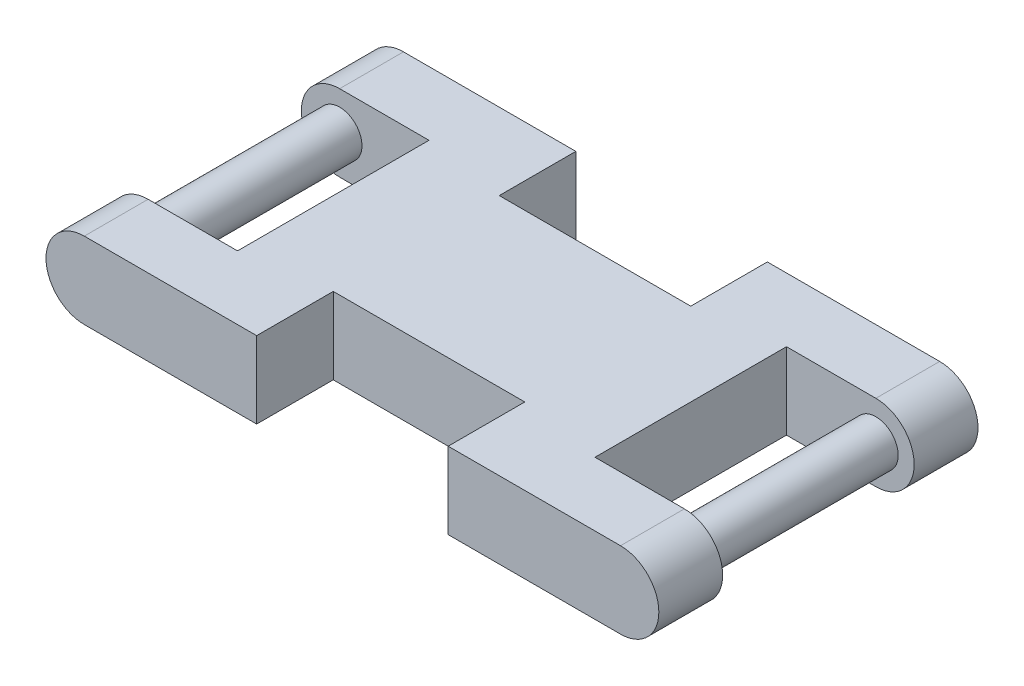
ISO-10303-21;
HEADER;
FILE_DESCRIPTION(('STEP AP214'),'2;1');
FILE_NAME('part.step','',(''),(''),'','','');
FILE_SCHEMA(('AUTOMOTIVE_DESIGN { 1 0 10303 214 1 1 1 1 }'));
ENDSEC;
DATA;
#1=APPLICATION_CONTEXT('core data for automotive mechanical design processes');
#2=APPLICATION_PROTOCOL_DEFINITION('international standard','automotive_design',2000,#1);
#3=PRODUCT_CONTEXT('',#1,'mechanical');
#4=PRODUCT('Part','Part','',(#3));
#5=PRODUCT_RELATED_PRODUCT_CATEGORY('part','',(#4));
#6=PRODUCT_DEFINITION_FORMATION('','',#4);
#7=PRODUCT_DEFINITION_CONTEXT('part definition',#1,'design');
#8=PRODUCT_DEFINITION('design','',#6,#7);
#9=PRODUCT_DEFINITION_SHAPE('','',#8);
#10=(LENGTH_UNIT() NAMED_UNIT(*) SI_UNIT(.MILLI.,.METRE.));
#11=(NAMED_UNIT(*) PLANE_ANGLE_UNIT() SI_UNIT($,.RADIAN.));
#12=(NAMED_UNIT(*) SI_UNIT($,.STERADIAN.) SOLID_ANGLE_UNIT());
#13=UNCERTAINTY_MEASURE_WITH_UNIT(LENGTH_MEASURE(1.E-05),#10,'distance_accuracy_value','');
#14=(GEOMETRIC_REPRESENTATION_CONTEXT(3) GLOBAL_UNCERTAINTY_ASSIGNED_CONTEXT((#13)) GLOBAL_UNIT_ASSIGNED_CONTEXT((#10,
#11,#12)) REPRESENTATION_CONTEXT('',''));
#15=CARTESIAN_POINT('',(0.,0.,0.));
#16=DIRECTION('',(0.,0.,1.));
#17=DIRECTION('',(1.,0.,0.));
#18=AXIS2_PLACEMENT_3D('',#15,#16,#17);
#19=CARTESIAN_POINT('',(-105.,-15.,125.));
#20=DIRECTION('',(0.,1.,0.));
#21=DIRECTION('',(-1.,0.,0.));
#22=AXIS2_PLACEMENT_3D('',#19,#20,#21);
#23=PLANE('',#22);
#24=DIRECTION('',(0.,0.,1.));
#25=VECTOR('',#24,1.);
#26=CARTESIAN_POINT('',(37.5,-15.0000000000001,0.));
#27=LINE('',#26,#25);
#28=CARTESIAN_POINT('',(37.5,-15.0000000000001,0.));
#29=VERTEX_POINT('',#28);
#30=CARTESIAN_POINT('',(37.5,-15.0000000000001,30.));
#31=VERTEX_POINT('',#30);
#32=EDGE_CURVE('E201',#29,#31,#27,.T.);
#33=ORIENTED_EDGE('',*,*,#32,.F.);
#34=DIRECTION('',(1.,0.,0.));
#35=VECTOR('',#34,1.);
#36=CARTESIAN_POINT('',(-105.,-15.,0.));
#37=LINE('',#36,#35);
#38=CARTESIAN_POINT('',(105.,-15.,0.));
#39=VERTEX_POINT('',#38);
#40=EDGE_CURVE('E364',#29,#39,#37,.T.);
#41=ORIENTED_EDGE('',*,*,#40,.T.);
#42=DIRECTION('',(0.,0.,-1.));
#43=VECTOR('',#42,1.);
#44=CARTESIAN_POINT('',(105.,-15.,125.));
#45=LINE('',#44,#43);
#46=CARTESIAN_POINT('',(105.,-15.,25.));
#47=VERTEX_POINT('',#46);
#48=EDGE_CURVE('E384',#47,#39,#45,.T.);
#49=ORIENTED_EDGE('',*,*,#48,.F.);
#50=DIRECTION('',(1.,0.,0.));
#51=VECTOR('',#50,1.);
#52=CARTESIAN_POINT('',(-105.,-15.,25.0000000000001));
#53=LINE('',#52,#51);
#54=CARTESIAN_POINT('',(70.0000000000001,-15.,25.));
#55=VERTEX_POINT('',#54);
#56=EDGE_CURVE('E321',#55,#47,#53,.T.);
#57=ORIENTED_EDGE('',*,*,#56,.F.);
#58=DIRECTION('',(0.,0.,1.));
#59=VECTOR('',#58,1.);
#60=CARTESIAN_POINT('',(70.0000000000001,-15.,125.));
#61=LINE('',#60,#59);
#62=CARTESIAN_POINT('',(70.0000000000001,-15.,100.));
#63=VERTEX_POINT('',#62);
#64=EDGE_CURVE('E287',#55,#63,#61,.T.);
#65=ORIENTED_EDGE('',*,*,#64,.T.);
#66=DIRECTION('',(1.,0.,0.));
#67=VECTOR('',#66,1.);
#68=CARTESIAN_POINT('',(-105.,-15.,99.9999999999999));
#69=LINE('',#68,#67);
#70=CARTESIAN_POINT('',(105.,-15.,100.));
#71=VERTEX_POINT('',#70);
#72=EDGE_CURVE('E314',#63,#71,#69,.T.);
#73=ORIENTED_EDGE('',*,*,#72,.T.);
#74=CARTESIAN_POINT('',(105.,-15.,125.));
#75=VERTEX_POINT('',#74);
#76=EDGE_CURVE('E385',#75,#71,#45,.T.);
#77=ORIENTED_EDGE('',*,*,#76,.F.);
#78=DIRECTION('',(1.,0.,0.));
#79=VECTOR('',#78,1.);
#80=CARTESIAN_POINT('',(-105.,-15.,125.));
#81=LINE('',#80,#79);
#82=CARTESIAN_POINT('',(37.5,-15.,125.));
#83=VERTEX_POINT('',#82);
#84=EDGE_CURVE('E346',#83,#75,#81,.T.);
#85=ORIENTED_EDGE('',*,*,#84,.F.);
#86=DIRECTION('',(0.,0.,-1.));
#87=VECTOR('',#86,1.);
#88=CARTESIAN_POINT('',(37.5,-15.0000000000001,0.));
#89=LINE('',#88,#87);
#90=CARTESIAN_POINT('',(37.5,-15.0000000000001,95.));
#91=VERTEX_POINT('',#90);
#92=EDGE_CURVE('E61',#83,#91,#89,.T.);
#93=ORIENTED_EDGE('',*,*,#92,.T.);
#94=DIRECTION('',(1.,0.,0.));
#95=VECTOR('',#94,1.);
#96=CARTESIAN_POINT('',(0.,-15.0000000000001,95.));
#97=LINE('',#96,#95);
#98=CARTESIAN_POINT('',(-37.5,-15.0000000000001,95.));
#99=VERTEX_POINT('',#98);
#100=EDGE_CURVE('E232',#99,#91,#97,.T.);
#101=ORIENTED_EDGE('',*,*,#100,.F.);
#102=DIRECTION('',(0.,0.,-1.));
#103=VECTOR('',#102,1.);
#104=CARTESIAN_POINT('',(-37.5,-15.0000000000001,0.));
#105=LINE('',#104,#103);
#106=CARTESIAN_POINT('',(-37.5,-15.0000000000001,125.));
#107=VERTEX_POINT('',#106);
#108=EDGE_CURVE('E236',#107,#99,#105,.T.);
#109=ORIENTED_EDGE('',*,*,#108,.F.);
#110=CARTESIAN_POINT('',(-105.,-15.,125.));
#111=VERTEX_POINT('',#110);
#112=EDGE_CURVE('E348',#111,#107,#81,.T.);
#113=ORIENTED_EDGE('',*,*,#112,.F.);
#114=DIRECTION('',(0.,0.,-1.));
#115=VECTOR('',#114,1.);
#116=CARTESIAN_POINT('',(-105.,-15.,125.));
#117=LINE('',#116,#115);
#118=CARTESIAN_POINT('',(-105.,-15.,100.));
#119=VERTEX_POINT('',#118);
#120=EDGE_CURVE('E390',#111,#119,#117,.T.);
#121=ORIENTED_EDGE('',*,*,#120,.T.);
#122=DIRECTION('',(-1.,0.,0.));
#123=VECTOR('',#122,1.);
#124=CARTESIAN_POINT('',(-105.,-15.,100.));
#125=LINE('',#124,#123);
#126=CARTESIAN_POINT('',(-70.,-15.,100.));
#127=VERTEX_POINT('',#126);
#128=EDGE_CURVE('E334',#127,#119,#125,.T.);
#129=ORIENTED_EDGE('',*,*,#128,.F.);
#130=DIRECTION('',(0.,0.,1.));
#131=VECTOR('',#130,1.);
#132=CARTESIAN_POINT('',(-70.,-15.,125.));
#133=LINE('',#132,#131);
#134=CARTESIAN_POINT('',(-70.,-15.,25.));
#135=VERTEX_POINT('',#134);
#136=EDGE_CURVE('E324',#135,#127,#133,.T.);
#137=ORIENTED_EDGE('',*,*,#136,.F.);
#138=DIRECTION('',(-1.,0.,0.));
#139=VECTOR('',#138,1.);
#140=CARTESIAN_POINT('',(-105.,-15.,25.));
#141=LINE('',#140,#139);
#142=CARTESIAN_POINT('',(-105.,-15.,25.));
#143=VERTEX_POINT('',#142);
#144=EDGE_CURVE('E327',#135,#143,#141,.T.);
#145=ORIENTED_EDGE('',*,*,#144,.T.);
#146=CARTESIAN_POINT('',(-105.,-15.,0.));
#147=VERTEX_POINT('',#146);
#148=EDGE_CURVE('E389',#143,#147,#117,.T.);
#149=ORIENTED_EDGE('',*,*,#148,.T.);
#150=CARTESIAN_POINT('',(-37.5,-15.,0.));
#151=VERTEX_POINT('',#150);
#152=EDGE_CURVE('E205',#147,#151,#37,.T.);
#153=ORIENTED_EDGE('',*,*,#152,.T.);
#154=DIRECTION('',(0.,0.,1.));
#155=VECTOR('',#154,1.);
#156=CARTESIAN_POINT('',(-37.5,-15.0000000000001,0.));
#157=LINE('',#156,#155);
#158=CARTESIAN_POINT('',(-37.5,-15.0000000000001,30.));
#159=VERTEX_POINT('',#158);
#160=EDGE_CURVE('E69',#151,#159,#157,.T.);
#161=ORIENTED_EDGE('',*,*,#160,.T.);
#162=DIRECTION('',(1.,0.,0.));
#163=VECTOR('',#162,1.);
#164=CARTESIAN_POINT('',(0.,-15.0000000000001,30.));
#165=LINE('',#164,#163);
#166=EDGE_CURVE('E196',#159,#31,#165,.T.);
#167=ORIENTED_EDGE('',*,*,#166,.T.);
#168=EDGE_LOOP('',(#33,#41,#49,#57,#65,#73,#77,#85,#93,#101,#109,#113,#121,#129,#137,#145,#149,
#153,#161,#167));
#169=FACE_BOUND('',#168,.T.);
#170=ADVANCED_FACE('F45',(#169),#23,.F.);
#171=CARTESIAN_POINT('',(-105.,15.,125.));
#172=DIRECTION('',(0.,-1.,0.));
#173=DIRECTION('',(1.,0.,0.));
#174=AXIS2_PLACEMENT_3D('',#171,#172,#173);
#175=PLANE('',#174);
#176=DIRECTION('',(0.,0.,1.));
#177=VECTOR('',#176,1.);
#178=CARTESIAN_POINT('',(37.5,15.0000000000001,0.));
#179=LINE('',#178,#177);
#180=CARTESIAN_POINT('',(37.5,15.0000000000001,0.));
#181=VERTEX_POINT('',#180);
#182=CARTESIAN_POINT('',(37.5,15.0000000000001,30.));
#183=VERTEX_POINT('',#182);
#184=EDGE_CURVE('E207',#181,#183,#179,.T.);
#185=ORIENTED_EDGE('',*,*,#184,.T.);
#186=DIRECTION('',(1.,0.,0.));
#187=VECTOR('',#186,1.);
#188=CARTESIAN_POINT('',(0.,15.0000000000001,30.));
#189=LINE('',#188,#187);
#190=CARTESIAN_POINT('',(-37.5,15.,30.));
#191=VERTEX_POINT('',#190);
#192=EDGE_CURVE('E211',#191,#183,#189,.T.);
#193=ORIENTED_EDGE('',*,*,#192,.F.);
#194=DIRECTION('',(0.,0.,1.));
#195=VECTOR('',#194,1.);
#196=CARTESIAN_POINT('',(-37.5,15.,0.));
#197=LINE('',#196,#195);
#198=CARTESIAN_POINT('',(-37.5,15.,0.));
#199=VERTEX_POINT('',#198);
#200=EDGE_CURVE('E186',#199,#191,#197,.T.);
#201=ORIENTED_EDGE('',*,*,#200,.F.);
#202=DIRECTION('',(-1.,0.,0.));
#203=VECTOR('',#202,1.);
#204=CARTESIAN_POINT('',(-105.,15.,0.));
#205=LINE('',#204,#203);
#206=CARTESIAN_POINT('',(-105.,15.,0.));
#207=VERTEX_POINT('',#206);
#208=EDGE_CURVE('E371',#199,#207,#205,.T.);
#209=ORIENTED_EDGE('',*,*,#208,.T.);
#210=DIRECTION('',(0.,0.,-1.));
#211=VECTOR('',#210,1.);
#212=CARTESIAN_POINT('',(-105.,15.,125.));
#213=LINE('',#212,#211);
#214=CARTESIAN_POINT('',(-105.,15.,25.));
#215=VERTEX_POINT('',#214);
#216=EDGE_CURVE('E360',#215,#207,#213,.T.);
#217=ORIENTED_EDGE('',*,*,#216,.F.);
#218=DIRECTION('',(-1.,0.,0.));
#219=VECTOR('',#218,1.);
#220=CARTESIAN_POINT('',(0.,15.0000000000001,25.));
#221=LINE('',#220,#219);
#222=CARTESIAN_POINT('',(-70.,15.,25.));
#223=VERTEX_POINT('',#222);
#224=EDGE_CURVE('E279',#223,#215,#221,.T.);
#225=ORIENTED_EDGE('',*,*,#224,.F.);
#226=DIRECTION('',(0.,0.,1.));
#227=VECTOR('',#226,1.);
#228=CARTESIAN_POINT('',(-70.,15.,0.));
#229=LINE('',#228,#227);
#230=CARTESIAN_POINT('',(-70.,15.,100.));
#231=VERTEX_POINT('',#230);
#232=EDGE_CURVE('E274',#223,#231,#229,.T.);
#233=ORIENTED_EDGE('',*,*,#232,.T.);
#234=DIRECTION('',(-1.,0.,0.));
#235=VECTOR('',#234,1.);
#236=CARTESIAN_POINT('',(0.,15.0000000000001,100.));
#237=LINE('',#236,#235);
#238=CARTESIAN_POINT('',(-105.,15.,100.));
#239=VERTEX_POINT('',#238);
#240=EDGE_CURVE('E270',#231,#239,#237,.T.);
#241=ORIENTED_EDGE('',*,*,#240,.T.);
#242=CARTESIAN_POINT('',(-105.,15.,125.));
#243=VERTEX_POINT('',#242);
#244=EDGE_CURVE('E375',#243,#239,#213,.T.);
#245=ORIENTED_EDGE('',*,*,#244,.F.);
#246=DIRECTION('',(-1.,0.,0.));
#247=VECTOR('',#246,1.);
#248=CARTESIAN_POINT('',(-105.,15.,125.));
#249=LINE('',#248,#247);
#250=CARTESIAN_POINT('',(-37.5,15.,125.));
#251=VERTEX_POINT('',#250);
#252=EDGE_CURVE('E355',#251,#243,#249,.T.);
#253=ORIENTED_EDGE('',*,*,#252,.F.);
#254=DIRECTION('',(0.,0.,-1.));
#255=VECTOR('',#254,1.);
#256=CARTESIAN_POINT('',(-37.5,15.,0.));
#257=LINE('',#256,#255);
#258=CARTESIAN_POINT('',(-37.5,15.,95.));
#259=VERTEX_POINT('',#258);
#260=EDGE_CURVE('E233',#251,#259,#257,.T.);
#261=ORIENTED_EDGE('',*,*,#260,.T.);
#262=DIRECTION('',(1.,0.,0.));
#263=VECTOR('',#262,1.);
#264=CARTESIAN_POINT('',(0.,15.0000000000001,95.));
#265=LINE('',#264,#263);
#266=CARTESIAN_POINT('',(37.5,15.0000000000001,95.));
#267=VERTEX_POINT('',#266);
#268=EDGE_CURVE('E244',#259,#267,#265,.T.);
#269=ORIENTED_EDGE('',*,*,#268,.T.);
#270=DIRECTION('',(0.,0.,-1.));
#271=VECTOR('',#270,1.);
#272=CARTESIAN_POINT('',(37.5,15.0000000000001,0.));
#273=LINE('',#272,#271);
#274=CARTESIAN_POINT('',(37.5,15.0000000000001,125.));
#275=VERTEX_POINT('',#274);
#276=EDGE_CURVE('E240',#275,#267,#273,.T.);
#277=ORIENTED_EDGE('',*,*,#276,.F.);
#278=CARTESIAN_POINT('',(105.,15.0000000000001,125.));
#279=VERTEX_POINT('',#278);
#280=EDGE_CURVE('E356',#279,#275,#249,.T.);
#281=ORIENTED_EDGE('',*,*,#280,.F.);
#282=DIRECTION('',(0.,0.,-1.));
#283=VECTOR('',#282,1.);
#284=CARTESIAN_POINT('',(105.,15.0000000000001,125.));
#285=LINE('',#284,#283);
#286=CARTESIAN_POINT('',(105.,15.0000000000001,100.));
#287=VERTEX_POINT('',#286);
#288=EDGE_CURVE('E380',#279,#287,#285,.T.);
#289=ORIENTED_EDGE('',*,*,#288,.T.);
#290=DIRECTION('',(1.,0.,0.));
#291=VECTOR('',#290,1.);
#292=CARTESIAN_POINT('',(0.,15.0000000000001,99.9999999999999));
#293=LINE('',#292,#291);
#294=CARTESIAN_POINT('',(70.0000000000001,15.0000000000001,100.));
#295=VERTEX_POINT('',#294);
#296=EDGE_CURVE('E298',#295,#287,#293,.T.);
#297=ORIENTED_EDGE('',*,*,#296,.F.);
#298=DIRECTION('',(0.,0.,1.));
#299=VECTOR('',#298,1.);
#300=CARTESIAN_POINT('',(70.0000000000001,15.0000000000001,0.));
#301=LINE('',#300,#299);
#302=CARTESIAN_POINT('',(70.0000000000001,15.0000000000001,25.));
#303=VERTEX_POINT('',#302);
#304=EDGE_CURVE('E294',#303,#295,#301,.T.);
#305=ORIENTED_EDGE('',*,*,#304,.F.);
#306=DIRECTION('',(1.,0.,0.));
#307=VECTOR('',#306,1.);
#308=CARTESIAN_POINT('',(0.,15.0000000000001,25.));
#309=LINE('',#308,#307);
#310=CARTESIAN_POINT('',(105.,15.0000000000001,25.));
#311=VERTEX_POINT('',#310);
#312=EDGE_CURVE('E269',#303,#311,#309,.T.);
#313=ORIENTED_EDGE('',*,*,#312,.T.);
#314=CARTESIAN_POINT('',(105.,15.0000000000001,0.));
#315=VERTEX_POINT('',#314);
#316=EDGE_CURVE('E379',#311,#315,#285,.T.);
#317=ORIENTED_EDGE('',*,*,#316,.T.);
#318=EDGE_CURVE('E347',#315,#181,#205,.T.);
#319=ORIENTED_EDGE('',*,*,#318,.T.);
#320=EDGE_LOOP('',(#185,#193,#201,#209,#217,#225,#233,#241,#245,#253,#261,#269,#277,#281,#289,
#297,#305,#313,#317,#319));
#321=FACE_BOUND('',#320,.T.);
#322=ADVANCED_FACE('F435',(#321),#175,.F.);
#323=CARTESIAN_POINT('',(-105.,0.,125.));
#324=DIRECTION('',(0.,0.,1.));
#325=DIRECTION('',(1.,0.,0.));
#326=AXIS2_PLACEMENT_3D('',#323,#324,#325);
#327=PLANE('',#326);
#328=ORIENTED_EDGE('',*,*,#112,.T.);
#329=DIRECTION('',(0.,1.,0.));
#330=VECTOR('',#329,1.);
#331=CARTESIAN_POINT('',(-37.5,-15.0000000000001,125.));
#332=LINE('',#331,#330);
#333=EDGE_CURVE('E218',#107,#251,#332,.T.);
#334=ORIENTED_EDGE('',*,*,#333,.T.);
#335=ORIENTED_EDGE('',*,*,#252,.T.);
#336=CARTESIAN_POINT('',(-105.,0.,125.));
#337=DIRECTION('',(0.,0.,1.));
#338=DIRECTION('',(1.,0.,0.));
#339=AXIS2_PLACEMENT_3D('',#336,#337,#338);
#340=CIRCLE('',#339,15.);
#341=EDGE_CURVE('E342',#243,#111,#340,.T.);
#342=ORIENTED_EDGE('',*,*,#341,.T.);
#343=EDGE_LOOP('',(#328,#334,#335,#342));
#344=FACE_BOUND('',#343,.T.);
#345=ADVANCED_FACE('F467',(#344),#327,.T.);
#346=CARTESIAN_POINT('',(-105.,0.,0.));
#347=DIRECTION('',(0.,0.,1.));
#348=DIRECTION('',(1.,0.,0.));
#349=AXIS2_PLACEMENT_3D('',#346,#347,#348);
#350=PLANE('',#349);
#351=DIRECTION('',(0.,1.,0.));
#352=VECTOR('',#351,1.);
#353=CARTESIAN_POINT('',(37.5,-15.0000000000001,0.));
#354=LINE('',#353,#352);
#355=EDGE_CURVE('E221',#29,#181,#354,.T.);
#356=ORIENTED_EDGE('',*,*,#355,.T.);
#357=ORIENTED_EDGE('',*,*,#318,.F.);
#358=CARTESIAN_POINT('',(105.,0.,0.));
#359=DIRECTION('',(0.,0.,1.));
#360=DIRECTION('',(1.,0.,0.));
#361=AXIS2_PLACEMENT_3D('',#358,#359,#360);
#362=CIRCLE('',#361,15.);
#363=EDGE_CURVE('E367',#39,#315,#362,.T.);
#364=ORIENTED_EDGE('',*,*,#363,.F.);
#365=ORIENTED_EDGE('',*,*,#40,.F.);
#366=EDGE_LOOP('',(#356,#357,#364,#365));
#367=FACE_BOUND('',#366,.T.);
#368=ADVANCED_FACE('F433',(#367),#350,.F.);
#369=CARTESIAN_POINT('',(-105.,0.,125.));
#370=DIRECTION('',(0.,0.,-1.));
#371=DIRECTION('',(-1.,0.,0.));
#372=AXIS2_PLACEMENT_3D('',#369,#370,#371);
#373=CYLINDRICAL_SURFACE('',#372,15.);
#374=CARTESIAN_POINT('',(-105.,0.,100.));
#375=DIRECTION('',(0.,0.,-1.));
#376=DIRECTION('',(-1.,0.,0.));
#377=AXIS2_PLACEMENT_3D('',#374,#375,#376);
#378=CIRCLE('',#377,15.);
#379=EDGE_CURVE('E338',#119,#239,#378,.T.);
#380=ORIENTED_EDGE('',*,*,#379,.F.);
#381=ORIENTED_EDGE('',*,*,#120,.F.);
#382=ORIENTED_EDGE('',*,*,#341,.F.);
#383=ORIENTED_EDGE('',*,*,#244,.T.);
#384=EDGE_LOOP('',(#380,#381,#382,#383));
#385=FACE_BOUND('',#384,.T.);
#386=ADVANCED_FACE('F471',(#385),#373,.T.);
#387=CARTESIAN_POINT('',(105.,0.,125.));
#388=DIRECTION('',(0.,0.,-1.));
#389=DIRECTION('',(-1.,0.,0.));
#390=AXIS2_PLACEMENT_3D('',#387,#388,#389);
#391=CYLINDRICAL_SURFACE('',#390,15.);
#392=ORIENTED_EDGE('',*,*,#316,.F.);
#393=CARTESIAN_POINT('',(105.,0.,25.));
#394=DIRECTION('',(0.,0.,1.));
#395=DIRECTION('',(1.,0.,0.));
#396=AXIS2_PLACEMENT_3D('',#393,#394,#395);
#397=CIRCLE('',#396,15.);
#398=EDGE_CURVE('E318',#47,#311,#397,.T.);
#399=ORIENTED_EDGE('',*,*,#398,.F.);
#400=ORIENTED_EDGE('',*,*,#48,.T.);
#401=ORIENTED_EDGE('',*,*,#363,.T.);
#402=EDGE_LOOP('',(#392,#399,#400,#401));
#403=FACE_BOUND('',#402,.T.);
#404=ADVANCED_FACE('F431',(#403),#391,.T.);
#405=CARTESIAN_POINT('',(-105.,0.,25.));
#406=DIRECTION('',(0.,0.,-1.));
#407=DIRECTION('',(-1.,0.,0.));
#408=AXIS2_PLACEMENT_3D('',#405,#406,#407);
#409=CIRCLE('',#408,15.);
#410=EDGE_CURVE('E331',#143,#215,#409,.T.);
#411=ORIENTED_EDGE('',*,*,#410,.T.);
#412=ORIENTED_EDGE('',*,*,#216,.T.);
#413=CARTESIAN_POINT('',(-105.,0.,0.));
#414=DIRECTION('',(0.,0.,1.));
#415=DIRECTION('',(1.,0.,0.));
#416=AXIS2_PLACEMENT_3D('',#413,#414,#415);
#417=CIRCLE('',#416,15.);
#418=EDGE_CURVE('E341',#207,#147,#417,.T.);
#419=ORIENTED_EDGE('',*,*,#418,.T.);
#420=ORIENTED_EDGE('',*,*,#148,.F.);
#421=EDGE_LOOP('',(#411,#412,#419,#420));
#422=FACE_BOUND('',#421,.T.);
#423=ADVANCED_FACE('F47',(#422),#373,.T.);
#424=CARTESIAN_POINT('',(105.,0.,100.));
#425=DIRECTION('',(0.,0.,1.));
#426=DIRECTION('',(1.,0.,0.));
#427=AXIS2_PLACEMENT_3D('',#424,#425,#426);
#428=CIRCLE('',#427,15.);
#429=EDGE_CURVE('E311',#71,#287,#428,.T.);
#430=ORIENTED_EDGE('',*,*,#429,.T.);
#431=ORIENTED_EDGE('',*,*,#288,.F.);
#432=CARTESIAN_POINT('',(105.,0.,125.));
#433=DIRECTION('',(0.,0.,1.));
#434=DIRECTION('',(1.,0.,0.));
#435=AXIS2_PLACEMENT_3D('',#432,#433,#434);
#436=CIRCLE('',#435,15.);
#437=EDGE_CURVE('E352',#75,#279,#436,.T.);
#438=ORIENTED_EDGE('',*,*,#437,.F.);
#439=ORIENTED_EDGE('',*,*,#76,.T.);
#440=EDGE_LOOP('',(#430,#431,#438,#439));
#441=FACE_BOUND('',#440,.T.);
#442=ADVANCED_FACE('F449',(#441),#391,.T.);
#443=DIRECTION('',(0.,1.,0.));
#444=VECTOR('',#443,1.);
#445=CARTESIAN_POINT('',(37.5,-15.0000000000001,125.));
#446=LINE('',#445,#444);
#447=EDGE_CURVE('E239',#83,#275,#446,.T.);
#448=ORIENTED_EDGE('',*,*,#447,.F.);
#449=ORIENTED_EDGE('',*,*,#84,.T.);
#450=ORIENTED_EDGE('',*,*,#437,.T.);
#451=ORIENTED_EDGE('',*,*,#280,.T.);
#452=EDGE_LOOP('',(#448,#449,#450,#451));
#453=FACE_BOUND('',#452,.T.);
#454=ADVANCED_FACE('F453',(#453),#327,.T.);
#455=ORIENTED_EDGE('',*,*,#208,.F.);
#456=DIRECTION('',(0.,1.,0.));
#457=VECTOR('',#456,1.);
#458=CARTESIAN_POINT('',(-37.5,-15.0000000000001,0.));
#459=LINE('',#458,#457);
#460=EDGE_CURVE('E192',#151,#199,#459,.T.);
#461=ORIENTED_EDGE('',*,*,#460,.F.);
#462=ORIENTED_EDGE('',*,*,#152,.F.);
#463=ORIENTED_EDGE('',*,*,#418,.F.);
#464=EDGE_LOOP('',(#455,#461,#462,#463));
#465=FACE_BOUND('',#464,.T.);
#466=ADVANCED_FACE('F478',(#465),#350,.F.);
#467=CARTESIAN_POINT('',(0.,-85.,25.));
#468=DIRECTION('',(0.,0.,1.));
#469=DIRECTION('',(1.,0.,0.));
#470=AXIS2_PLACEMENT_3D('',#467,#468,#469);
#471=PLANE('',#470);
#472=CARTESIAN_POINT('',(105.,0.,25.));
#473=DIRECTION('',(0.,0.,1.));
#474=DIRECTION('',(1.,0.,0.));
#475=AXIS2_PLACEMENT_3D('',#472,#473,#474);
#476=CIRCLE('',#475,8.75);
#477=CARTESIAN_POINT('',(96.25,0.,25.));
#478=VERTEX_POINT('',#477);
#479=EDGE_CURVE('E11',#478,#478,#476,.T.);
#480=ORIENTED_EDGE('',*,*,#479,.F.);
#481=EDGE_LOOP('',(#480));
#482=FACE_BOUND('',#481,.T.);
#483=ORIENTED_EDGE('',*,*,#56,.T.);
#484=ORIENTED_EDGE('',*,*,#398,.T.);
#485=ORIENTED_EDGE('',*,*,#312,.F.);
#486=DIRECTION('',(0.,1.,0.));
#487=VECTOR('',#486,1.);
#488=CARTESIAN_POINT('',(70.0000000000001,-84.9999999999999,25.));
#489=LINE('',#488,#487);
#490=EDGE_CURVE('E302',#55,#303,#489,.T.);
#491=ORIENTED_EDGE('',*,*,#490,.F.);
#492=EDGE_LOOP('',(#483,#484,#485,#491));
#493=FACE_BOUND('',#492,.T.);
#494=ADVANCED_FACE('F440',(#482,#493),#471,.T.);
#495=CARTESIAN_POINT('',(0.,-85.,99.9999999999999));
#496=DIRECTION('',(0.,0.,1.));
#497=DIRECTION('',(1.,0.,0.));
#498=AXIS2_PLACEMENT_3D('',#495,#496,#497);
#499=PLANE('',#498);
#500=CARTESIAN_POINT('',(105.,0.,100.));
#501=DIRECTION('',(0.,0.,-1.));
#502=DIRECTION('',(-1.,0.,0.));
#503=AXIS2_PLACEMENT_3D('',#500,#501,#502);
#504=CIRCLE('',#503,8.75);
#505=CARTESIAN_POINT('',(96.25,0.,100.));
#506=VERTEX_POINT('',#505);
#507=EDGE_CURVE('E225',#506,#506,#504,.F.);
#508=ORIENTED_EDGE('',*,*,#507,.T.);
#509=EDGE_LOOP('',(#508));
#510=FACE_BOUND('',#509,.T.);
#511=DIRECTION('',(0.,1.,0.));
#512=VECTOR('',#511,1.);
#513=CARTESIAN_POINT('',(70.0000000000001,-84.9999999999999,100.));
#514=LINE('',#513,#512);
#515=EDGE_CURVE('E275',#63,#295,#514,.T.);
#516=ORIENTED_EDGE('',*,*,#515,.T.);
#517=ORIENTED_EDGE('',*,*,#296,.T.);
#518=ORIENTED_EDGE('',*,*,#429,.F.);
#519=ORIENTED_EDGE('',*,*,#72,.F.);
#520=EDGE_LOOP('',(#516,#517,#518,#519));
#521=FACE_BOUND('',#520,.T.);
#522=ADVANCED_FACE('F485',(#510,#521),#499,.F.);
#523=CARTESIAN_POINT('',(70.0000000000001,-84.9999999999999,0.));
#524=DIRECTION('',(-1.,0.,0.));
#525=DIRECTION('',(0.,-1.,0.));
#526=AXIS2_PLACEMENT_3D('',#523,#524,#525);
#527=PLANE('',#526);
#528=ORIENTED_EDGE('',*,*,#490,.T.);
#529=ORIENTED_EDGE('',*,*,#304,.T.);
#530=ORIENTED_EDGE('',*,*,#515,.F.);
#531=ORIENTED_EDGE('',*,*,#64,.F.);
#532=EDGE_LOOP('',(#528,#529,#530,#531));
#533=FACE_BOUND('',#532,.T.);
#534=ADVANCED_FACE('F442',(#533),#527,.F.);
#535=CARTESIAN_POINT('',(0.,-85.,100.));
#536=DIRECTION('',(0.,0.,-1.));
#537=DIRECTION('',(-1.,0.,0.));
#538=AXIS2_PLACEMENT_3D('',#535,#536,#537);
#539=PLANE('',#538);
#540=CARTESIAN_POINT('',(-105.,0.,100.));
#541=DIRECTION('',(0.,0.,-1.));
#542=DIRECTION('',(-1.,0.,0.));
#543=AXIS2_PLACEMENT_3D('',#540,#541,#542);
#544=CIRCLE('',#543,8.75);
#545=CARTESIAN_POINT('',(-113.75,0.,100.));
#546=VERTEX_POINT('',#545);
#547=EDGE_CURVE('E265',#546,#546,#544,.T.);
#548=ORIENTED_EDGE('',*,*,#547,.F.);
#549=EDGE_LOOP('',(#548));
#550=FACE_BOUND('',#549,.T.);
#551=ORIENTED_EDGE('',*,*,#379,.T.);
#552=ORIENTED_EDGE('',*,*,#240,.F.);
#553=DIRECTION('',(0.,1.,0.));
#554=VECTOR('',#553,1.);
#555=CARTESIAN_POINT('',(-70.,-85.,100.));
#556=LINE('',#555,#554);
#557=EDGE_CURVE('E283',#127,#231,#556,.T.);
#558=ORIENTED_EDGE('',*,*,#557,.F.);
#559=ORIENTED_EDGE('',*,*,#128,.T.);
#560=EDGE_LOOP('',(#551,#552,#558,#559));
#561=FACE_BOUND('',#560,.T.);
#562=ADVANCED_FACE('F403',(#550,#561),#539,.T.);
#563=CARTESIAN_POINT('',(0.,-85.,25.));
#564=DIRECTION('',(0.,0.,-1.));
#565=DIRECTION('',(-1.,0.,0.));
#566=AXIS2_PLACEMENT_3D('',#563,#564,#565);
#567=PLANE('',#566);
#568=CARTESIAN_POINT('',(-105.,0.,25.));
#569=DIRECTION('',(0.,0.,-1.));
#570=DIRECTION('',(-1.,0.,0.));
#571=AXIS2_PLACEMENT_3D('',#568,#569,#570);
#572=CIRCLE('',#571,8.75);
#573=CARTESIAN_POINT('',(-113.75,0.,25.));
#574=VERTEX_POINT('',#573);
#575=EDGE_CURVE('E54',#574,#574,#572,.F.);
#576=ORIENTED_EDGE('',*,*,#575,.F.);
#577=EDGE_LOOP('',(#576));
#578=FACE_BOUND('',#577,.T.);
#579=ORIENTED_EDGE('',*,*,#410,.F.);
#580=ORIENTED_EDGE('',*,*,#144,.F.);
#581=DIRECTION('',(0.,1.,0.));
#582=VECTOR('',#581,1.);
#583=CARTESIAN_POINT('',(-70.,-85.,25.));
#584=LINE('',#583,#582);
#585=EDGE_CURVE('E284',#135,#223,#584,.T.);
#586=ORIENTED_EDGE('',*,*,#585,.T.);
#587=ORIENTED_EDGE('',*,*,#224,.T.);
#588=EDGE_LOOP('',(#579,#580,#586,#587));
#589=FACE_BOUND('',#588,.T.);
#590=ADVANCED_FACE('F399',(#578,#589),#567,.F.);
#591=CARTESIAN_POINT('',(-70.,-85.,0.));
#592=DIRECTION('',(-1.,0.,0.));
#593=DIRECTION('',(0.,-1.,0.));
#594=AXIS2_PLACEMENT_3D('',#591,#592,#593);
#595=PLANE('',#594);
#596=ORIENTED_EDGE('',*,*,#136,.T.);
#597=ORIENTED_EDGE('',*,*,#557,.T.);
#598=ORIENTED_EDGE('',*,*,#232,.F.);
#599=ORIENTED_EDGE('',*,*,#585,.F.);
#600=EDGE_LOOP('',(#596,#597,#598,#599));
#601=FACE_BOUND('',#600,.T.);
#602=ADVANCED_FACE('F402',(#601),#595,.T.);
#603=CARTESIAN_POINT('',(-105.,0.,124.748737341529));
#604=DIRECTION('',(0.,0.,-1.));
#605=DIRECTION('',(-1.,0.,0.));
#606=AXIS2_PLACEMENT_3D('',#603,#604,#605);
#607=CYLINDRICAL_SURFACE('',#606,8.75);
#608=CARTESIAN_POINT('',(-113.75,0.,100.));
#609=CARTESIAN_POINT('',(-113.75,0.,99.21875));
#610=CARTESIAN_POINT('',(-113.75,0.,98.4375));
#611=CARTESIAN_POINT('',(-113.75,0.,96.875));
#612=CARTESIAN_POINT('',(-113.75,0.,96.09375));
#613=CARTESIAN_POINT('',(-113.75,0.,94.53125));
#614=CARTESIAN_POINT('',(-113.75,0.,93.75));
#615=CARTESIAN_POINT('',(-113.75,0.,92.1875));
#616=CARTESIAN_POINT('',(-113.75,0.,91.40625));
#617=CARTESIAN_POINT('',(-113.75,0.,89.84375));
#618=CARTESIAN_POINT('',(-113.75,0.,89.0625));
#619=CARTESIAN_POINT('',(-113.75,0.,87.5));
#620=CARTESIAN_POINT('',(-113.75,0.,86.71875));
#621=CARTESIAN_POINT('',(-113.75,0.,85.15625));
#622=CARTESIAN_POINT('',(-113.75,0.,84.375));
#623=CARTESIAN_POINT('',(-113.75,0.,82.8125));
#624=CARTESIAN_POINT('',(-113.75,0.,82.03125));
#625=CARTESIAN_POINT('',(-113.75,0.,80.46875));
#626=CARTESIAN_POINT('',(-113.75,0.,79.6875));
#627=CARTESIAN_POINT('',(-113.75,0.,78.125));
#628=CARTESIAN_POINT('',(-113.75,0.,77.34375));
#629=CARTESIAN_POINT('',(-113.75,0.,75.78125));
#630=CARTESIAN_POINT('',(-113.75,0.,75.));
#631=CARTESIAN_POINT('',(-113.75,0.,73.4375));
#632=CARTESIAN_POINT('',(-113.75,0.,72.65625));
#633=CARTESIAN_POINT('',(-113.75,0.,71.09375));
#634=CARTESIAN_POINT('',(-113.75,0.,70.3125));
#635=CARTESIAN_POINT('',(-113.75,0.,68.75));
#636=CARTESIAN_POINT('',(-113.75,0.,67.96875));
#637=CARTESIAN_POINT('',(-113.75,0.,66.40625));
#638=CARTESIAN_POINT('',(-113.75,0.,65.625));
#639=CARTESIAN_POINT('',(-113.75,0.,64.0625));
#640=CARTESIAN_POINT('',(-113.75,0.,63.28125));
#641=CARTESIAN_POINT('',(-113.75,0.,61.71875));
#642=CARTESIAN_POINT('',(-113.75,0.,60.9375));
#643=CARTESIAN_POINT('',(-113.75,0.,59.375));
#644=CARTESIAN_POINT('',(-113.75,0.,58.59375));
#645=CARTESIAN_POINT('',(-113.75,0.,57.03125));
#646=CARTESIAN_POINT('',(-113.75,0.,56.25));
#647=CARTESIAN_POINT('',(-113.75,0.,54.6875));
#648=CARTESIAN_POINT('',(-113.75,0.,53.90625));
#649=CARTESIAN_POINT('',(-113.75,0.,52.34375));
#650=CARTESIAN_POINT('',(-113.75,0.,51.5625));
#651=CARTESIAN_POINT('',(-113.75,0.,50.));
#652=CARTESIAN_POINT('',(-113.75,0.,49.21875));
#653=CARTESIAN_POINT('',(-113.75,0.,47.65625));
#654=CARTESIAN_POINT('',(-113.75,0.,46.875));
#655=CARTESIAN_POINT('',(-113.75,0.,45.3125));
#656=CARTESIAN_POINT('',(-113.75,0.,44.53125));
#657=CARTESIAN_POINT('',(-113.75,0.,42.96875));
#658=CARTESIAN_POINT('',(-113.75,0.,42.1875));
#659=CARTESIAN_POINT('',(-113.75,0.,40.625));
#660=CARTESIAN_POINT('',(-113.75,0.,39.84375));
#661=CARTESIAN_POINT('',(-113.75,0.,38.28125));
#662=CARTESIAN_POINT('',(-113.75,0.,37.5));
#663=CARTESIAN_POINT('',(-113.75,0.,35.9375));
#664=CARTESIAN_POINT('',(-113.75,0.,35.15625));
#665=CARTESIAN_POINT('',(-113.75,0.,33.59375));
#666=CARTESIAN_POINT('',(-113.75,0.,32.8125));
#667=CARTESIAN_POINT('',(-113.75,0.,31.25));
#668=CARTESIAN_POINT('',(-113.75,0.,30.46875));
#669=CARTESIAN_POINT('',(-113.75,0.,28.90625));
#670=CARTESIAN_POINT('',(-113.75,0.,28.125));
#671=CARTESIAN_POINT('',(-113.75,0.,26.5625));
#672=CARTESIAN_POINT('',(-113.75,0.,25.78125));
#673=CARTESIAN_POINT('',(-113.75,0.,25.));
#674=B_SPLINE_CURVE_WITH_KNOTS('',3,(#608,#609,#610,#611,#612,#613,#614,#615,#616,#617,#618,
#619,#620,#621,#622,#623,#624,#625,#626,#627,#628,#629,#630,#631,#632,#633,#634,#635,#636,#637,
#638,#639,#640,#641,#642,#643,#644,#645,#646,#647,#648,#649,#650,#651,#652,#653,#654,#655,#656,
#657,#658,#659,#660,#661,#662,#663,#664,#665,#666,#667,#668,#669,#670,#671,#672,#673),
.UNSPECIFIED.,.F.,.F.,(4,2,2,2,2,2,2,2,2,2,2,2,2,2,2,2,2,2,2,2,2,2,2,2,2,2,2,2,2,2,2,2,4),(0.,
2.34375000000001,4.6875,7.03125,9.37500000000001,11.71875,14.0625,16.40625,18.75,21.09375,
23.4375,25.78125,28.125,30.46875,32.8125,35.15625,37.5,39.84375,42.1875,44.53125,46.875,
49.21875,51.5625,53.90625,56.25,58.59375,60.9375,63.28125,65.625,67.96875,70.3125,72.65625,75.),.UNSPECIFIED.);
#675=EDGE_CURVE('BSEAM397',#546,#574,#674,.T.);
#676=ORIENTED_EDGE('',*,*,#547,.T.);
#677=ORIENTED_EDGE('',*,*,#575,.T.);
#678=ORIENTED_EDGE('',*,*,#675,.T.);
#679=ORIENTED_EDGE('',*,*,#675,.F.);
#680=EDGE_LOOP('',(#676,#678,#677,#679));
#681=FACE_BOUND('',#680,.T.);
#682=ADVANCED_FACE('F397',(#681),#607,.T.);
#683=CARTESIAN_POINT('',(105.,0.,124.748737341529));
#684=DIRECTION('',(0.,0.,-1.));
#685=DIRECTION('',(-1.,0.,0.));
#686=AXIS2_PLACEMENT_3D('',#683,#684,#685);
#687=CYLINDRICAL_SURFACE('',#686,8.75);
#688=CARTESIAN_POINT('',(96.25,0.,100.));
#689=CARTESIAN_POINT('',(96.25,0.,99.2187500000001));
#690=CARTESIAN_POINT('',(96.25,0.,98.4375));
#691=CARTESIAN_POINT('',(96.25,0.,96.875));
#692=CARTESIAN_POINT('',(96.25,0.,96.09375));
#693=CARTESIAN_POINT('',(96.25,0.,94.53125));
#694=CARTESIAN_POINT('',(96.25,0.,93.75));
#695=CARTESIAN_POINT('',(96.25,0.,92.1875));
#696=CARTESIAN_POINT('',(96.25,0.,91.40625));
#697=CARTESIAN_POINT('',(96.25,0.,89.84375));
#698=CARTESIAN_POINT('',(96.25,0.,89.0625));
#699=CARTESIAN_POINT('',(96.25,0.,87.5));
#700=CARTESIAN_POINT('',(96.25,0.,86.71875));
#701=CARTESIAN_POINT('',(96.25,0.,85.15625));
#702=CARTESIAN_POINT('',(96.25,0.,84.375));
#703=CARTESIAN_POINT('',(96.25,0.,82.8125));
#704=CARTESIAN_POINT('',(96.25,0.,82.03125));
#705=CARTESIAN_POINT('',(96.25,0.,80.46875));
#706=CARTESIAN_POINT('',(96.25,0.,79.6875));
#707=CARTESIAN_POINT('',(96.25,0.,78.125));
#708=CARTESIAN_POINT('',(96.25,0.,77.34375));
#709=CARTESIAN_POINT('',(96.25,0.,75.78125));
#710=CARTESIAN_POINT('',(96.25,0.,75.));
#711=CARTESIAN_POINT('',(96.25,0.,73.4375));
#712=CARTESIAN_POINT('',(96.25,0.,72.65625));
#713=CARTESIAN_POINT('',(96.25,0.,71.09375));
#714=CARTESIAN_POINT('',(96.25,0.,70.3125));
#715=CARTESIAN_POINT('',(96.25,0.,68.75));
#716=CARTESIAN_POINT('',(96.25,0.,67.96875));
#717=CARTESIAN_POINT('',(96.25,0.,66.40625));
#718=CARTESIAN_POINT('',(96.25,0.,65.625));
#719=CARTESIAN_POINT('',(96.25,0.,64.0625));
#720=CARTESIAN_POINT('',(96.25,0.,63.28125));
#721=CARTESIAN_POINT('',(96.25,0.,61.71875));
#722=CARTESIAN_POINT('',(96.25,0.,60.9375));
#723=CARTESIAN_POINT('',(96.25,0.,59.375));
#724=CARTESIAN_POINT('',(96.25,0.,58.59375));
#725=CARTESIAN_POINT('',(96.25,0.,57.03125));
#726=CARTESIAN_POINT('',(96.25,0.,56.25));
#727=CARTESIAN_POINT('',(96.25,0.,54.6875));
#728=CARTESIAN_POINT('',(96.25,0.,53.90625));
#729=CARTESIAN_POINT('',(96.25,0.,52.34375));
#730=CARTESIAN_POINT('',(96.25,0.,51.5625));
#731=CARTESIAN_POINT('',(96.25,0.,50.));
#732=CARTESIAN_POINT('',(96.25,0.,49.21875));
#733=CARTESIAN_POINT('',(96.25,0.,47.65625));
#734=CARTESIAN_POINT('',(96.25,0.,46.875));
#735=CARTESIAN_POINT('',(96.25,0.,45.3125));
#736=CARTESIAN_POINT('',(96.25,0.,44.53125));
#737=CARTESIAN_POINT('',(96.25,0.,42.96875));
#738=CARTESIAN_POINT('',(96.25,0.,42.1875));
#739=CARTESIAN_POINT('',(96.25,0.,40.625));
#740=CARTESIAN_POINT('',(96.25,0.,39.84375));
#741=CARTESIAN_POINT('',(96.25,0.,38.28125));
#742=CARTESIAN_POINT('',(96.25,0.,37.5));
#743=CARTESIAN_POINT('',(96.25,0.,35.9375));
#744=CARTESIAN_POINT('',(96.25,0.,35.15625));
#745=CARTESIAN_POINT('',(96.25,0.,33.59375));
#746=CARTESIAN_POINT('',(96.25,0.,32.8125));
#747=CARTESIAN_POINT('',(96.25,0.,31.25));
#748=CARTESIAN_POINT('',(96.25,0.,30.46875));
#749=CARTESIAN_POINT('',(96.25,0.,28.90625));
#750=CARTESIAN_POINT('',(96.25,0.,28.125));
#751=CARTESIAN_POINT('',(96.25,0.,26.5625));
#752=CARTESIAN_POINT('',(96.25,0.,25.78125));
#753=CARTESIAN_POINT('',(96.25,0.,25.));
#754=B_SPLINE_CURVE_WITH_KNOTS('',3,(#688,#689,#690,#691,#692,#693,#694,#695,#696,#697,#698,
#699,#700,#701,#702,#703,#704,#705,#706,#707,#708,#709,#710,#711,#712,#713,#714,#715,#716,#717,
#718,#719,#720,#721,#722,#723,#724,#725,#726,#727,#728,#729,#730,#731,#732,#733,#734,#735,#736,
#737,#738,#739,#740,#741,#742,#743,#744,#745,#746,#747,#748,#749,#750,#751,#752,#753),
.UNSPECIFIED.,.F.,.F.,(4,2,2,2,2,2,2,2,2,2,2,2,2,2,2,2,2,2,2,2,2,2,2,2,2,2,2,2,2,2,2,2,4),(0.,
2.34375000000001,4.68750000000001,7.03125,9.37500000000001,11.71875,14.0625,16.40625,18.75,
21.09375,23.4375,25.78125,28.125,30.46875,32.8125,35.15625,37.5,39.84375,42.1875,44.53125,
46.875,49.21875,51.5625,53.90625,56.25,58.59375,60.9375,63.28125,65.6250000000001,
67.9687500000001,70.3125,72.65625,75.0000000000001),.UNSPECIFIED.);
#755=EDGE_CURVE('BSEAM532',#506,#478,#754,.T.);
#756=ORIENTED_EDGE('',*,*,#507,.F.);
#757=ORIENTED_EDGE('',*,*,#479,.T.);
#758=ORIENTED_EDGE('',*,*,#755,.T.);
#759=ORIENTED_EDGE('',*,*,#755,.F.);
#760=EDGE_LOOP('',(#756,#758,#757,#759));
#761=FACE_BOUND('',#760,.T.);
#762=ADVANCED_FACE('F532',(#761),#687,.T.);
#763=CARTESIAN_POINT('',(37.5,-15.0000000000001,0.));
#764=DIRECTION('',(-1.,0.,0.));
#765=DIRECTION('',(0.,-1.,0.));
#766=AXIS2_PLACEMENT_3D('',#763,#764,#765);
#767=PLANE('',#766);
#768=ORIENTED_EDGE('',*,*,#184,.F.);
#769=ORIENTED_EDGE('',*,*,#355,.F.);
#770=ORIENTED_EDGE('',*,*,#32,.T.);
#771=DIRECTION('',(0.,1.,0.));
#772=VECTOR('',#771,1.);
#773=CARTESIAN_POINT('',(37.5,-15.0000000000001,30.));
#774=LINE('',#773,#772);
#775=EDGE_CURVE('E191',#31,#183,#774,.T.);
#776=ORIENTED_EDGE('',*,*,#775,.T.);
#777=EDGE_LOOP('',(#768,#769,#770,#776));
#778=FACE_BOUND('',#777,.T.);
#779=ADVANCED_FACE('F537',(#778),#767,.T.);
#780=CARTESIAN_POINT('',(0.,-15.0000000000001,30.));
#781=DIRECTION('',(0.,0.,1.));
#782=DIRECTION('',(1.,0.,0.));
#783=AXIS2_PLACEMENT_3D('',#780,#781,#782);
#784=PLANE('',#783);
#785=ORIENTED_EDGE('',*,*,#192,.T.);
#786=ORIENTED_EDGE('',*,*,#775,.F.);
#787=ORIENTED_EDGE('',*,*,#166,.F.);
#788=DIRECTION('',(0.,1.,0.));
#789=VECTOR('',#788,1.);
#790=CARTESIAN_POINT('',(-37.5,-15.0000000000001,30.));
#791=LINE('',#790,#789);
#792=EDGE_CURVE('E182',#159,#191,#791,.T.);
#793=ORIENTED_EDGE('',*,*,#792,.T.);
#794=EDGE_LOOP('',(#785,#786,#787,#793));
#795=FACE_BOUND('',#794,.T.);
#796=ADVANCED_FACE('F197',(#795),#784,.F.);
#797=CARTESIAN_POINT('',(-37.5,-15.0000000000001,0.));
#798=DIRECTION('',(-1.,0.,0.));
#799=DIRECTION('',(0.,-1.,0.));
#800=AXIS2_PLACEMENT_3D('',#797,#798,#799);
#801=PLANE('',#800);
#802=ORIENTED_EDGE('',*,*,#200,.T.);
#803=ORIENTED_EDGE('',*,*,#792,.F.);
#804=ORIENTED_EDGE('',*,*,#160,.F.);
#805=ORIENTED_EDGE('',*,*,#460,.T.);
#806=EDGE_LOOP('',(#802,#803,#804,#805));
#807=FACE_BOUND('',#806,.T.);
#808=ADVANCED_FACE('F184',(#807),#801,.F.);
#809=CARTESIAN_POINT('',(-37.5,-15.0000000000001,0.));
#810=DIRECTION('',(1.,0.,0.));
#811=DIRECTION('',(0.,1.,0.));
#812=AXIS2_PLACEMENT_3D('',#809,#810,#811);
#813=PLANE('',#812);
#814=ORIENTED_EDGE('',*,*,#260,.F.);
#815=ORIENTED_EDGE('',*,*,#333,.F.);
#816=ORIENTED_EDGE('',*,*,#108,.T.);
#817=DIRECTION('',(0.,1.,0.));
#818=VECTOR('',#817,1.);
#819=CARTESIAN_POINT('',(-37.5,-15.0000000000001,95.));
#820=LINE('',#819,#818);
#821=EDGE_CURVE('E254',#99,#259,#820,.T.);
#822=ORIENTED_EDGE('',*,*,#821,.T.);
#823=EDGE_LOOP('',(#814,#815,#816,#822));
#824=FACE_BOUND('',#823,.T.);
#825=ADVANCED_FACE('F465',(#824),#813,.T.);
#826=CARTESIAN_POINT('',(0.,-15.0000000000001,95.));
#827=DIRECTION('',(0.,0.,1.));
#828=DIRECTION('',(1.,0.,0.));
#829=AXIS2_PLACEMENT_3D('',#826,#827,#828);
#830=PLANE('',#829);
#831=ORIENTED_EDGE('',*,*,#268,.F.);
#832=ORIENTED_EDGE('',*,*,#821,.F.);
#833=ORIENTED_EDGE('',*,*,#100,.T.);
#834=DIRECTION('',(0.,1.,0.));
#835=VECTOR('',#834,1.);
#836=CARTESIAN_POINT('',(37.5,-15.0000000000001,95.));
#837=LINE('',#836,#835);
#838=EDGE_CURVE('E257',#91,#267,#837,.T.);
#839=ORIENTED_EDGE('',*,*,#838,.T.);
#840=EDGE_LOOP('',(#831,#832,#833,#839));
#841=FACE_BOUND('',#840,.T.);
#842=ADVANCED_FACE('F459',(#841),#830,.T.);
#843=CARTESIAN_POINT('',(37.5,-15.0000000000001,0.));
#844=DIRECTION('',(1.,0.,0.));
#845=DIRECTION('',(0.,0.,-1.));
#846=AXIS2_PLACEMENT_3D('',#843,#844,#845);
#847=PLANE('',#846);
#848=ORIENTED_EDGE('',*,*,#276,.T.);
#849=ORIENTED_EDGE('',*,*,#838,.F.);
#850=ORIENTED_EDGE('',*,*,#92,.F.);
#851=ORIENTED_EDGE('',*,*,#447,.T.);
#852=EDGE_LOOP('',(#848,#849,#850,#851));
#853=FACE_BOUND('',#852,.T.);
#854=ADVANCED_FACE('F460',(#853),#847,.F.);
#855=CLOSED_SHELL('',(#170,#322,#345,#368,#386,#404,#423,#442,#454,#466,#494,#522,#534,#562,
#590,#602,#682,#762,#779,#796,#808,#825,#842,#854));
#856=MANIFOLD_SOLID_BREP('B2',#855);
#857=ADVANCED_BREP_SHAPE_REPRESENTATION('',(#18,#856),#14);
#858=SHAPE_DEFINITION_REPRESENTATION(#9,#857);
ENDSEC;
END-ISO-10303-21;
